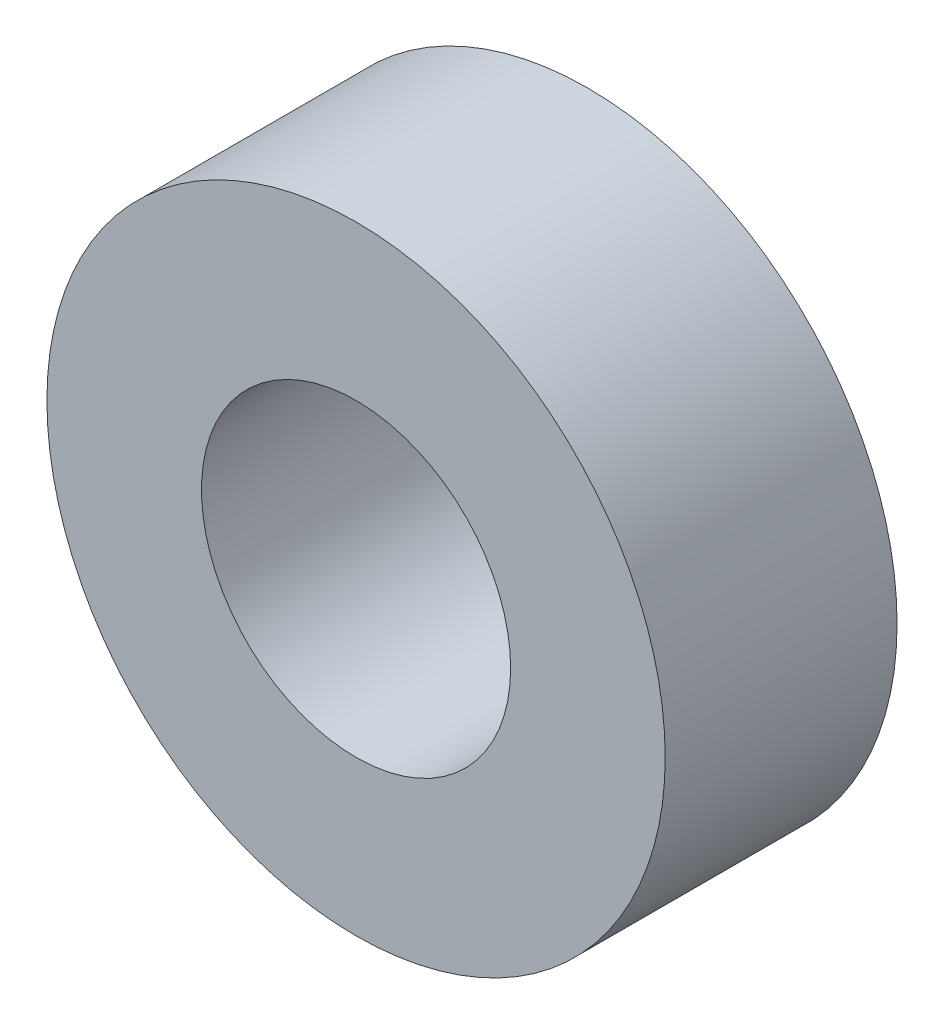
ISO-10303-21;
HEADER;
FILE_DESCRIPTION(('STEP AP214'),'2;1');
FILE_NAME('part.step','',(''),(''),'','','');
FILE_SCHEMA(('AUTOMOTIVE_DESIGN { 1 0 10303 214 1 1 1 1 }'));
ENDSEC;
DATA;
#1=APPLICATION_CONTEXT('core data for automotive mechanical design processes');
#2=APPLICATION_PROTOCOL_DEFINITION('international standard','automotive_design',2000,#1);
#3=PRODUCT_CONTEXT('',#1,'mechanical');
#4=PRODUCT('Part','Part','',(#3));
#5=PRODUCT_RELATED_PRODUCT_CATEGORY('part','',(#4));
#6=PRODUCT_DEFINITION_FORMATION('','',#4);
#7=PRODUCT_DEFINITION_CONTEXT('part definition',#1,'design');
#8=PRODUCT_DEFINITION('design','',#6,#7);
#9=PRODUCT_DEFINITION_SHAPE('','',#8);
#10=(LENGTH_UNIT() NAMED_UNIT(*) SI_UNIT(.MILLI.,.METRE.));
#11=(NAMED_UNIT(*) PLANE_ANGLE_UNIT() SI_UNIT($,.RADIAN.));
#12=(NAMED_UNIT(*) SI_UNIT($,.STERADIAN.) SOLID_ANGLE_UNIT());
#13=UNCERTAINTY_MEASURE_WITH_UNIT(LENGTH_MEASURE(1.E-05),#10,'distance_accuracy_value','');
#14=(GEOMETRIC_REPRESENTATION_CONTEXT(3) GLOBAL_UNCERTAINTY_ASSIGNED_CONTEXT((#13)) GLOBAL_UNIT_ASSIGNED_CONTEXT((#10,
#11,#12)) REPRESENTATION_CONTEXT('',''));
#15=CARTESIAN_POINT('',(0.,0.,0.));
#16=DIRECTION('',(0.,0.,1.));
#17=DIRECTION('',(1.,0.,0.));
#18=AXIS2_PLACEMENT_3D('',#15,#16,#17);
#19=CARTESIAN_POINT('',(0.,0.,3.));
#20=DIRECTION('',(0.,0.,1.));
#21=DIRECTION('',(1.,0.,0.));
#22=AXIS2_PLACEMENT_3D('',#19,#20,#21);
#23=PLANE('',#22);
#24=CARTESIAN_POINT('',(0.,0.,3.));
#25=DIRECTION('',(0.,0.,1.));
#26=DIRECTION('',(1.,0.,0.));
#27=AXIS2_PLACEMENT_3D('',#24,#25,#26);
#28=CIRCLE('',#27,4.);
#29=CARTESIAN_POINT('',(4.,0.,3.));
#30=VERTEX_POINT('',#29);
#31=EDGE_CURVE('E10',#30,#30,#28,.T.);
#32=ORIENTED_EDGE('',*,*,#31,.T.);
#33=EDGE_LOOP('',(#32));
#34=FACE_BOUND('',#33,.T.);
#35=CARTESIAN_POINT('',(0.,0.,3.));
#36=DIRECTION('',(0.,0.,1.));
#37=DIRECTION('',(1.,0.,0.));
#38=AXIS2_PLACEMENT_3D('',#35,#36,#37);
#39=CIRCLE('',#38,2.);
#40=CARTESIAN_POINT('',(2.,0.,3.));
#41=VERTEX_POINT('',#40);
#42=EDGE_CURVE('E54',#41,#41,#39,.T.);
#43=ORIENTED_EDGE('',*,*,#42,.F.);
#44=EDGE_LOOP('',(#43));
#45=FACE_BOUND('',#44,.T.);
#46=ADVANCED_FACE('F43',(#34,#45),#23,.T.);
#47=CARTESIAN_POINT('',(0.,0.,0.));
#48=DIRECTION('',(0.,0.,1.));
#49=DIRECTION('',(1.,0.,0.));
#50=AXIS2_PLACEMENT_3D('',#47,#48,#49);
#51=PLANE('',#50);
#52=CARTESIAN_POINT('',(0.,0.,0.));
#53=DIRECTION('',(0.,0.,1.));
#54=DIRECTION('',(1.,0.,0.));
#55=AXIS2_PLACEMENT_3D('',#52,#53,#54);
#56=CIRCLE('',#55,4.);
#57=CARTESIAN_POINT('',(4.,0.,0.));
#58=VERTEX_POINT('',#57);
#59=EDGE_CURVE('E47',#58,#58,#56,.T.);
#60=ORIENTED_EDGE('',*,*,#59,.F.);
#61=EDGE_LOOP('',(#60));
#62=FACE_BOUND('',#61,.T.);
#63=CARTESIAN_POINT('',(0.,0.,0.));
#64=DIRECTION('',(0.,0.,1.));
#65=DIRECTION('',(1.,0.,0.));
#66=AXIS2_PLACEMENT_3D('',#63,#64,#65);
#67=CIRCLE('',#66,2.);
#68=CARTESIAN_POINT('',(2.,0.,0.));
#69=VERTEX_POINT('',#68);
#70=EDGE_CURVE('E56',#69,#69,#67,.T.);
#71=ORIENTED_EDGE('',*,*,#70,.T.);
#72=EDGE_LOOP('',(#71));
#73=FACE_BOUND('',#72,.T.);
#74=ADVANCED_FACE('F66',(#62,#73),#51,.F.);
#75=CARTESIAN_POINT('',(0.,0.,3.));
#76=DIRECTION('',(0.,0.,-1.));
#77=DIRECTION('',(-1.,0.,0.));
#78=AXIS2_PLACEMENT_3D('',#75,#76,#77);
#79=CYLINDRICAL_SURFACE('',#78,4.);
#80=ORIENTED_EDGE('',*,*,#31,.F.);
#81=EDGE_LOOP('',(#80));
#82=FACE_BOUND('',#81,.T.);
#83=ORIENTED_EDGE('',*,*,#59,.T.);
#84=EDGE_LOOP('',(#83));
#85=FACE_BOUND('',#84,.T.);
#86=ADVANCED_FACE('F45',(#82,#85),#79,.T.);
#87=CARTESIAN_POINT('',(0.,0.,3.));
#88=DIRECTION('',(0.,0.,-1.));
#89=DIRECTION('',(-1.,0.,0.));
#90=AXIS2_PLACEMENT_3D('',#87,#88,#89);
#91=CYLINDRICAL_SURFACE('',#90,2.);
#92=ORIENTED_EDGE('',*,*,#42,.T.);
#93=EDGE_LOOP('',(#92));
#94=FACE_BOUND('',#93,.T.);
#95=ORIENTED_EDGE('',*,*,#70,.F.);
#96=EDGE_LOOP('',(#95));
#97=FACE_BOUND('',#96,.T.);
#98=ADVANCED_FACE('F62',(#94,#97),#91,.F.);
#99=CLOSED_SHELL('',(#46,#74,#86,#98));
#100=MANIFOLD_SOLID_BREP('B2',#99);
#101=ADVANCED_BREP_SHAPE_REPRESENTATION('',(#18,#100),#14);
#102=SHAPE_DEFINITION_REPRESENTATION(#9,#101);
ENDSEC;
END-ISO-10303-21;
